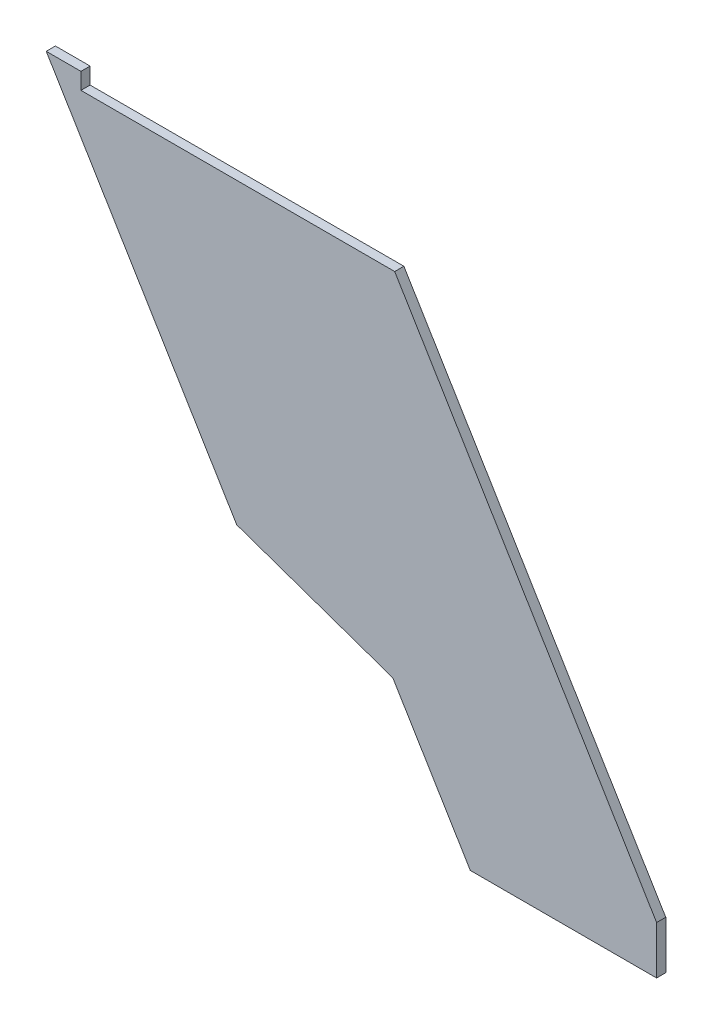
ISO-10303-21;
HEADER;
FILE_DESCRIPTION(('STEP AP214'),'2;1');
FILE_NAME('part.step','',(''),(''),'','','');
FILE_SCHEMA(('AUTOMOTIVE_DESIGN { 1 0 10303 214 1 1 1 1 }'));
ENDSEC;
DATA;
#1=APPLICATION_CONTEXT('core data for automotive mechanical design processes');
#2=APPLICATION_PROTOCOL_DEFINITION('international standard','automotive_design',2000,#1);
#3=PRODUCT_CONTEXT('',#1,'mechanical');
#4=PRODUCT('Part','Part','',(#3));
#5=PRODUCT_RELATED_PRODUCT_CATEGORY('part','',(#4));
#6=PRODUCT_DEFINITION_FORMATION('','',#4);
#7=PRODUCT_DEFINITION_CONTEXT('part definition',#1,'design');
#8=PRODUCT_DEFINITION('design','',#6,#7);
#9=PRODUCT_DEFINITION_SHAPE('','',#8);
#10=(LENGTH_UNIT() NAMED_UNIT(*) SI_UNIT(.MILLI.,.METRE.));
#11=(NAMED_UNIT(*) PLANE_ANGLE_UNIT() SI_UNIT($,.RADIAN.));
#12=(NAMED_UNIT(*) SI_UNIT($,.STERADIAN.) SOLID_ANGLE_UNIT());
#13=UNCERTAINTY_MEASURE_WITH_UNIT(LENGTH_MEASURE(1.E-05),#10,'distance_accuracy_value','');
#14=(GEOMETRIC_REPRESENTATION_CONTEXT(3) GLOBAL_UNCERTAINTY_ASSIGNED_CONTEXT((#13)) GLOBAL_UNIT_ASSIGNED_CONTEXT((#10,
#11,#12)) REPRESENTATION_CONTEXT('',''));
#15=CARTESIAN_POINT('',(0.,0.,0.));
#16=DIRECTION('',(0.,0.,1.));
#17=DIRECTION('',(1.,0.,0.));
#18=AXIS2_PLACEMENT_3D('',#15,#16,#17);
#19=CARTESIAN_POINT('',(62.1134049468729,-144.224375,2.5));
#20=DIRECTION('',(0.,1.,0.));
#21=DIRECTION('',(-1.,0.,0.));
#22=AXIS2_PLACEMENT_3D('',#19,#20,#21);
#23=PLANE('',#22);
#24=DIRECTION('',(1.,0.,0.));
#25=VECTOR('',#24,1.);
#26=CARTESIAN_POINT('',(62.1134049468729,-144.224375,-2.5));
#27=LINE('',#26,#25);
#28=CARTESIAN_POINT('',(62.1134049468729,-144.224375,-2.5));
#29=VERTEX_POINT('',#28);
#30=CARTESIAN_POINT('',(163.713404946873,-144.224375,-2.5));
#31=VERTEX_POINT('',#30);
#32=EDGE_CURVE('E135',#29,#31,#27,.T.);
#33=ORIENTED_EDGE('',*,*,#32,.T.);
#34=DIRECTION('',(0.,0.,-1.));
#35=VECTOR('',#34,1.);
#36=CARTESIAN_POINT('',(163.713404946873,-144.224375,2.5));
#37=LINE('',#36,#35);
#38=CARTESIAN_POINT('',(163.713404946873,-144.224375,2.5));
#39=VERTEX_POINT('',#38);
#40=EDGE_CURVE('E11',#39,#31,#37,.T.);
#41=ORIENTED_EDGE('',*,*,#40,.F.);
#42=DIRECTION('',(1.,0.,0.));
#43=VECTOR('',#42,1.);
#44=CARTESIAN_POINT('',(62.1134049468729,-144.224375,2.5));
#45=LINE('',#44,#43);
#46=CARTESIAN_POINT('',(62.1134049468729,-144.224375,2.5));
#47=VERTEX_POINT('',#46);
#48=EDGE_CURVE('E151',#47,#39,#45,.T.);
#49=ORIENTED_EDGE('',*,*,#48,.F.);
#50=DIRECTION('',(0.,0.,-1.));
#51=VECTOR('',#50,1.);
#52=CARTESIAN_POINT('',(62.1134049468729,-144.224375,2.5));
#53=LINE('',#52,#51);
#54=EDGE_CURVE('E131',#47,#29,#53,.T.);
#55=ORIENTED_EDGE('',*,*,#54,.T.);
#56=EDGE_LOOP('',(#33,#41,#49,#55));
#57=FACE_BOUND('',#56,.T.);
#58=ADVANCED_FACE('F33',(#57),#23,.F.);
#59=CARTESIAN_POINT('',(163.713404946873,-144.224375,2.5));
#60=DIRECTION('',(-1.,0.,0.));
#61=DIRECTION('',(0.,-1.,0.));
#62=AXIS2_PLACEMENT_3D('',#59,#60,#61);
#63=PLANE('',#62);
#64=DIRECTION('',(0.,1.,0.));
#65=VECTOR('',#64,1.);
#66=CARTESIAN_POINT('',(163.713404946873,-144.224375,-2.5));
#67=LINE('',#66,#65);
#68=CARTESIAN_POINT('',(163.713404946873,-118.030625,-2.5));
#69=VERTEX_POINT('',#68);
#70=EDGE_CURVE('E138',#31,#69,#67,.T.);
#71=ORIENTED_EDGE('',*,*,#70,.T.);
#72=DIRECTION('',(0.,0.,-1.));
#73=VECTOR('',#72,1.);
#74=CARTESIAN_POINT('',(163.713404946873,-118.030625,2.5));
#75=LINE('',#74,#73);
#76=CARTESIAN_POINT('',(163.713404946873,-118.030625,2.5));
#77=VERTEX_POINT('',#76);
#78=EDGE_CURVE('E41',#77,#69,#75,.T.);
#79=ORIENTED_EDGE('',*,*,#78,.F.);
#80=DIRECTION('',(0.,1.,0.));
#81=VECTOR('',#80,1.);
#82=CARTESIAN_POINT('',(163.713404946873,-144.224375,2.5));
#83=LINE('',#82,#81);
#84=EDGE_CURVE('E95',#39,#77,#83,.T.);
#85=ORIENTED_EDGE('',*,*,#84,.F.);
#86=ORIENTED_EDGE('',*,*,#40,.T.);
#87=EDGE_LOOP('',(#71,#79,#85,#86));
#88=FACE_BOUND('',#87,.T.);
#89=ADVANCED_FACE('F194',(#88),#63,.F.);
#90=CARTESIAN_POINT('',(163.713404946873,-118.030625,2.5));
#91=DIRECTION('',(-0.855588336059519,-0.517656835363838,0.));
#92=DIRECTION('',(0.517656835363838,-0.855588336059519,0.));
#93=AXIS2_PLACEMENT_3D('',#90,#91,#92);
#94=PLANE('',#93);
#95=DIRECTION('',(-0.517656835363839,0.855588336059519,0.));
#96=VECTOR('',#95,1.);
#97=CARTESIAN_POINT('',(163.713404946873,-118.030625,-2.5));
#98=LINE('',#97,#96);
#99=CARTESIAN_POINT('',(20.8892049468728,118.030625,-2.5));
#100=VERTEX_POINT('',#99);
#101=EDGE_CURVE('E140',#69,#100,#98,.T.);
#102=ORIENTED_EDGE('',*,*,#101,.T.);
#103=DIRECTION('',(0.,0.,-1.));
#104=VECTOR('',#103,1.);
#105=CARTESIAN_POINT('',(20.8892049468728,118.030625,2.5));
#106=LINE('',#105,#104);
#107=CARTESIAN_POINT('',(20.8892049468728,118.030625,2.5));
#108=VERTEX_POINT('',#107);
#109=EDGE_CURVE('E161',#108,#100,#106,.T.);
#110=ORIENTED_EDGE('',*,*,#109,.F.);
#111=DIRECTION('',(-0.517656835363839,0.855588336059519,0.));
#112=VECTOR('',#111,1.);
#113=CARTESIAN_POINT('',(163.713404946873,-118.030625,2.5));
#114=LINE('',#113,#112);
#115=EDGE_CURVE('E169',#77,#108,#114,.T.);
#116=ORIENTED_EDGE('',*,*,#115,.F.);
#117=ORIENTED_EDGE('',*,*,#78,.T.);
#118=EDGE_LOOP('',(#102,#110,#116,#117));
#119=FACE_BOUND('',#118,.T.);
#120=ADVANCED_FACE('F167',(#119),#94,.F.);
#121=CARTESIAN_POINT('',(20.8892049468728,118.030625,2.5));
#122=DIRECTION('',(0.,-1.,0.));
#123=DIRECTION('',(1.,0.,0.));
#124=AXIS2_PLACEMENT_3D('',#121,#122,#123);
#125=PLANE('',#124);
#126=DIRECTION('',(-1.,0.,0.));
#127=VECTOR('',#126,1.);
#128=CARTESIAN_POINT('',(20.8892049468728,118.030625,-2.5));
#129=LINE('',#128,#127);
#130=CARTESIAN_POINT('',(-150.230595053127,118.030625,-2.5));
#131=VERTEX_POINT('',#130);
#132=EDGE_CURVE('E142',#100,#131,#129,.T.);
#133=ORIENTED_EDGE('',*,*,#132,.T.);
#134=DIRECTION('',(0.,0.,-1.));
#135=VECTOR('',#134,1.);
#136=CARTESIAN_POINT('',(-150.230595053127,118.030625,2.5));
#137=LINE('',#136,#135);
#138=CARTESIAN_POINT('',(-150.230595053127,118.030625,2.5));
#139=VERTEX_POINT('',#138);
#140=EDGE_CURVE('E158',#139,#131,#137,.T.);
#141=ORIENTED_EDGE('',*,*,#140,.F.);
#142=DIRECTION('',(-1.,0.,0.));
#143=VECTOR('',#142,1.);
#144=CARTESIAN_POINT('',(20.8892049468728,118.030625,2.5));
#145=LINE('',#144,#143);
#146=EDGE_CURVE('E185',#108,#139,#145,.T.);
#147=ORIENTED_EDGE('',*,*,#146,.F.);
#148=ORIENTED_EDGE('',*,*,#109,.T.);
#149=EDGE_LOOP('',(#133,#141,#147,#148));
#150=FACE_BOUND('',#149,.T.);
#151=ADVANCED_FACE('F178',(#150),#125,.F.);
#152=CARTESIAN_POINT('',(-150.230595053127,118.030625,2.5));
#153=DIRECTION('',(-1.,0.,0.));
#154=DIRECTION('',(0.,0.,1.));
#155=AXIS2_PLACEMENT_3D('',#152,#153,#154);
#156=PLANE('',#155);
#157=DIRECTION('',(0.,1.,0.));
#158=VECTOR('',#157,1.);
#159=CARTESIAN_POINT('',(-150.230595053127,118.030625,-2.5));
#160=LINE('',#159,#158);
#161=CARTESIAN_POINT('',(-150.230595053127,127.022225,-2.5));
#162=VERTEX_POINT('',#161);
#163=EDGE_CURVE('E144',#131,#162,#160,.T.);
#164=ORIENTED_EDGE('',*,*,#163,.T.);
#165=DIRECTION('',(0.,0.,-1.));
#166=VECTOR('',#165,1.);
#167=CARTESIAN_POINT('',(-150.230595053127,127.022225,2.5));
#168=LINE('',#167,#166);
#169=CARTESIAN_POINT('',(-150.230595053127,127.022225,2.5));
#170=VERTEX_POINT('',#169);
#171=EDGE_CURVE('E155',#170,#162,#168,.T.);
#172=ORIENTED_EDGE('',*,*,#171,.F.);
#173=DIRECTION('',(0.,1.,0.));
#174=VECTOR('',#173,1.);
#175=CARTESIAN_POINT('',(-150.230595053127,118.030625,2.5));
#176=LINE('',#175,#174);
#177=EDGE_CURVE('E184',#139,#170,#176,.T.);
#178=ORIENTED_EDGE('',*,*,#177,.F.);
#179=ORIENTED_EDGE('',*,*,#140,.T.);
#180=EDGE_LOOP('',(#164,#172,#178,#179));
#181=FACE_BOUND('',#180,.T.);
#182=ADVANCED_FACE('F182',(#181),#156,.F.);
#183=CARTESIAN_POINT('',(-150.230595053127,127.022225,2.5));
#184=DIRECTION('',(0.,-1.,0.));
#185=DIRECTION('',(0.,0.,-1.));
#186=AXIS2_PLACEMENT_3D('',#183,#184,#185);
#187=PLANE('',#186);
#188=DIRECTION('',(-1.,0.,0.));
#189=VECTOR('',#188,1.);
#190=CARTESIAN_POINT('',(-150.230595053127,127.022225,-2.5));
#191=LINE('',#190,#189);
#192=CARTESIAN_POINT('',(-169.153595053127,127.022225,-2.5));
#193=VERTEX_POINT('',#192);
#194=EDGE_CURVE('E146',#162,#193,#191,.T.);
#195=ORIENTED_EDGE('',*,*,#194,.T.);
#196=DIRECTION('',(0.,0.,-1.));
#197=VECTOR('',#196,1.);
#198=CARTESIAN_POINT('',(-169.153595053127,127.022225,2.5));
#199=LINE('',#198,#197);
#200=CARTESIAN_POINT('',(-169.153595053127,127.022225,2.5));
#201=VERTEX_POINT('',#200);
#202=EDGE_CURVE('E126',#201,#193,#199,.T.);
#203=ORIENTED_EDGE('',*,*,#202,.F.);
#204=DIRECTION('',(-1.,0.,0.));
#205=VECTOR('',#204,1.);
#206=CARTESIAN_POINT('',(-150.230595053127,127.022225,2.5));
#207=LINE('',#206,#205);
#208=EDGE_CURVE('E117',#170,#201,#207,.T.);
#209=ORIENTED_EDGE('',*,*,#208,.F.);
#210=ORIENTED_EDGE('',*,*,#171,.T.);
#211=EDGE_LOOP('',(#195,#203,#209,#210));
#212=FACE_BOUND('',#211,.T.);
#213=ADVANCED_FACE('F206',(#212),#187,.F.);
#214=CARTESIAN_POINT('',(-169.153595053127,127.022225,2.5));
#215=DIRECTION('',(0.855588336059519,0.517656835363838,0.));
#216=DIRECTION('',(-0.517656835363838,0.855588336059519,0.));
#217=AXIS2_PLACEMENT_3D('',#214,#215,#216);
#218=PLANE('',#217);
#219=DIRECTION('',(0.517656835363839,-0.855588336059519,0.));
#220=VECTOR('',#219,1.);
#221=CARTESIAN_POINT('',(-169.153595053127,127.022225,-2.5));
#222=LINE('',#221,#220);
#223=CARTESIAN_POINT('',(-65.2805744690193,-44.660130513703,-2.5));
#224=VERTEX_POINT('',#223);
#225=EDGE_CURVE('E125',#193,#224,#222,.T.);
#226=ORIENTED_EDGE('',*,*,#225,.T.);
#227=DIRECTION('',(0.,0.,-1.));
#228=VECTOR('',#227,1.);
#229=CARTESIAN_POINT('',(-65.2805744690193,-44.660130513703,2.5));
#230=LINE('',#229,#228);
#231=CARTESIAN_POINT('',(-65.2805744690193,-44.660130513703,2.5));
#232=VERTEX_POINT('',#231);
#233=EDGE_CURVE('E122',#232,#224,#230,.T.);
#234=ORIENTED_EDGE('',*,*,#233,.F.);
#235=DIRECTION('',(0.517656835363839,-0.855588336059519,0.));
#236=VECTOR('',#235,1.);
#237=CARTESIAN_POINT('',(-169.153595053127,127.022225,2.5));
#238=LINE('',#237,#236);
#239=EDGE_CURVE('E111',#201,#232,#238,.T.);
#240=ORIENTED_EDGE('',*,*,#239,.F.);
#241=ORIENTED_EDGE('',*,*,#202,.T.);
#242=EDGE_LOOP('',(#226,#234,#240,#241));
#243=FACE_BOUND('',#242,.T.);
#244=ADVANCED_FACE('F123',(#243),#218,.F.);
#245=CARTESIAN_POINT('',(-65.2805744690193,-44.660130513703,2.5));
#246=DIRECTION('',(0.329538456839281,0.944142153207866,0.));
#247=DIRECTION('',(-0.944142153207866,0.329538456839281,0.));
#248=AXIS2_PLACEMENT_3D('',#245,#246,#247);
#249=PLANE('',#248);
#250=DIRECTION('',(0.944142153207866,-0.329538456839281,0.));
#251=VECTOR('',#250,1.);
#252=CARTESIAN_POINT('',(-65.2805744690193,-44.660130513703,-2.5));
#253=LINE('',#252,#251);
#254=CARTESIAN_POINT('',(19.8520411271015,-74.3743749999999,-2.5));
#255=VERTEX_POINT('',#254);
#256=EDGE_CURVE('E81',#224,#255,#253,.T.);
#257=ORIENTED_EDGE('',*,*,#256,.T.);
#258=DIRECTION('',(0.,0.,-1.));
#259=VECTOR('',#258,1.);
#260=CARTESIAN_POINT('',(19.8520411271015,-74.3743749999999,2.5));
#261=LINE('',#260,#259);
#262=CARTESIAN_POINT('',(19.8520411271015,-74.3743749999999,2.5));
#263=VERTEX_POINT('',#262);
#264=EDGE_CURVE('E127',#263,#255,#261,.T.);
#265=ORIENTED_EDGE('',*,*,#264,.F.);
#266=DIRECTION('',(0.944142153207866,-0.329538456839281,0.));
#267=VECTOR('',#266,1.);
#268=CARTESIAN_POINT('',(-65.2805744690193,-44.660130513703,2.5));
#269=LINE('',#268,#267);
#270=EDGE_CURVE('E115',#232,#263,#269,.T.);
#271=ORIENTED_EDGE('',*,*,#270,.F.);
#272=ORIENTED_EDGE('',*,*,#233,.T.);
#273=EDGE_LOOP('',(#257,#265,#271,#272));
#274=FACE_BOUND('',#273,.T.);
#275=ADVANCED_FACE('F129',(#274),#249,.F.);
#276=CARTESIAN_POINT('',(19.8520411271015,-74.3743749999999,2.5));
#277=DIRECTION('',(0.855588336059518,0.517656835363839,0.));
#278=DIRECTION('',(-0.517656835363839,0.855588336059518,0.));
#279=AXIS2_PLACEMENT_3D('',#276,#277,#278);
#280=PLANE('',#279);
#281=DIRECTION('',(0.517656835363839,-0.855588336059519,0.));
#282=VECTOR('',#281,1.);
#283=CARTESIAN_POINT('',(19.8520411271015,-74.3743749999999,-2.5));
#284=LINE('',#283,#282);
#285=EDGE_CURVE('E87',#255,#29,#284,.T.);
#286=ORIENTED_EDGE('',*,*,#285,.T.);
#287=ORIENTED_EDGE('',*,*,#54,.F.);
#288=DIRECTION('',(0.517656835363839,-0.855588336059519,0.));
#289=VECTOR('',#288,1.);
#290=CARTESIAN_POINT('',(19.8520411271015,-74.3743749999999,2.5));
#291=LINE('',#290,#289);
#292=EDGE_CURVE('E49',#263,#47,#291,.T.);
#293=ORIENTED_EDGE('',*,*,#292,.F.);
#294=ORIENTED_EDGE('',*,*,#264,.T.);
#295=EDGE_LOOP('',(#286,#287,#293,#294));
#296=FACE_BOUND('',#295,.T.);
#297=ADVANCED_FACE('F214',(#296),#280,.F.);
#298=CARTESIAN_POINT('',(0.,0.,2.5));
#299=DIRECTION('',(0.,0.,1.));
#300=DIRECTION('',(1.,0.,0.));
#301=AXIS2_PLACEMENT_3D('',#298,#299,#300);
#302=PLANE('',#301);
#303=ORIENTED_EDGE('',*,*,#48,.T.);
#304=ORIENTED_EDGE('',*,*,#84,.T.);
#305=ORIENTED_EDGE('',*,*,#115,.T.);
#306=ORIENTED_EDGE('',*,*,#146,.T.);
#307=ORIENTED_EDGE('',*,*,#177,.T.);
#308=ORIENTED_EDGE('',*,*,#208,.T.);
#309=ORIENTED_EDGE('',*,*,#239,.T.);
#310=ORIENTED_EDGE('',*,*,#270,.T.);
#311=ORIENTED_EDGE('',*,*,#292,.T.);
#312=EDGE_LOOP('',(#303,#304,#305,#306,#307,#308,#309,#310,#311));
#313=FACE_BOUND('',#312,.T.);
#314=ADVANCED_FACE('F113',(#313),#302,.T.);
#315=CARTESIAN_POINT('',(0.,0.,-2.5));
#316=DIRECTION('',(0.,0.,1.));
#317=DIRECTION('',(1.,0.,0.));
#318=AXIS2_PLACEMENT_3D('',#315,#316,#317);
#319=PLANE('',#318);
#320=ORIENTED_EDGE('',*,*,#32,.F.);
#321=ORIENTED_EDGE('',*,*,#285,.F.);
#322=ORIENTED_EDGE('',*,*,#256,.F.);
#323=ORIENTED_EDGE('',*,*,#225,.F.);
#324=ORIENTED_EDGE('',*,*,#194,.F.);
#325=ORIENTED_EDGE('',*,*,#163,.F.);
#326=ORIENTED_EDGE('',*,*,#132,.F.);
#327=ORIENTED_EDGE('',*,*,#101,.F.);
#328=ORIENTED_EDGE('',*,*,#70,.F.);
#329=EDGE_LOOP('',(#320,#321,#322,#323,#324,#325,#326,#327,#328));
#330=FACE_BOUND('',#329,.T.);
#331=ADVANCED_FACE('F173',(#330),#319,.F.);
#332=CLOSED_SHELL('',(#58,#89,#120,#151,#182,#213,#244,#275,#297,#314,#331));
#333=MANIFOLD_SOLID_BREP('B2',#332);
#334=ADVANCED_BREP_SHAPE_REPRESENTATION('',(#18,#333),#14);
#335=SHAPE_DEFINITION_REPRESENTATION(#9,#334);
ENDSEC;
END-ISO-10303-21;
